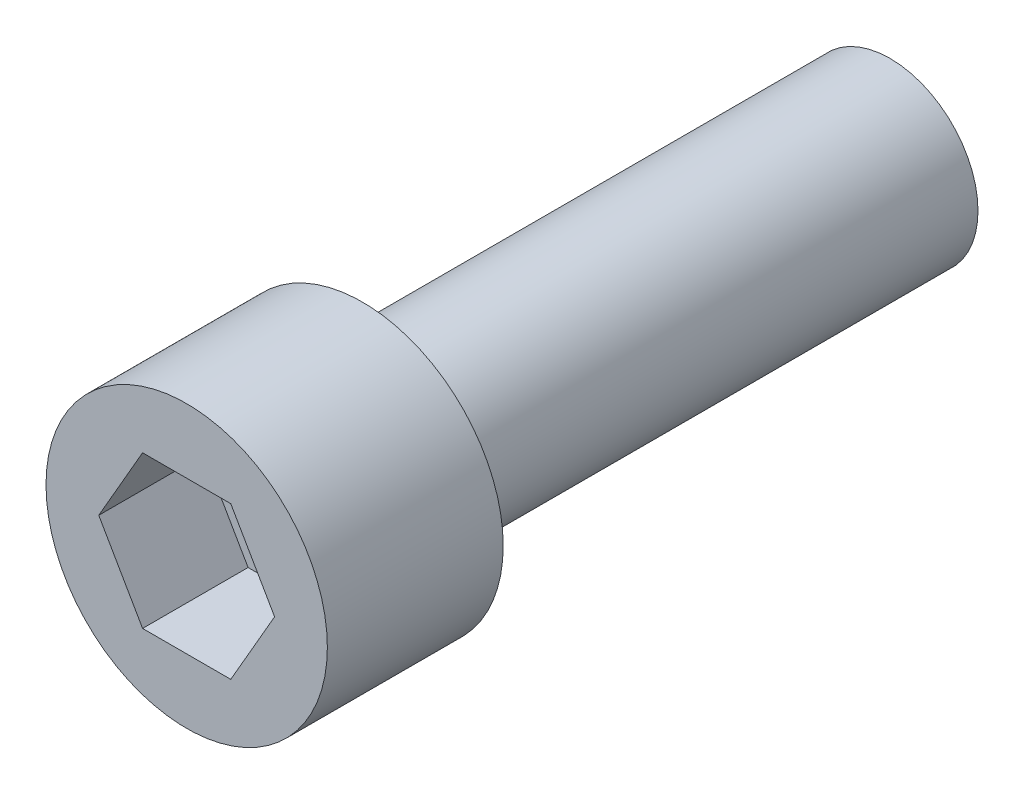
ISO-10303-21;
HEADER;
FILE_DESCRIPTION(('STEP AP214'),'2;1');
FILE_NAME('part.step','',(''),(''),'','','');
FILE_SCHEMA(('AUTOMOTIVE_DESIGN { 1 0 10303 214 1 1 1 1 }'));
ENDSEC;
DATA;
#1=APPLICATION_CONTEXT('core data for automotive mechanical design processes');
#2=APPLICATION_PROTOCOL_DEFINITION('international standard','automotive_design',2000,#1);
#3=PRODUCT_CONTEXT('',#1,'mechanical');
#4=PRODUCT('Part','Part','',(#3));
#5=PRODUCT_RELATED_PRODUCT_CATEGORY('part','',(#4));
#6=PRODUCT_DEFINITION_FORMATION('','',#4);
#7=PRODUCT_DEFINITION_CONTEXT('part definition',#1,'design');
#8=PRODUCT_DEFINITION('design','',#6,#7);
#9=PRODUCT_DEFINITION_SHAPE('','',#8);
#10=(LENGTH_UNIT() NAMED_UNIT(*) SI_UNIT(.MILLI.,.METRE.));
#11=(NAMED_UNIT(*) PLANE_ANGLE_UNIT() SI_UNIT($,.RADIAN.));
#12=(NAMED_UNIT(*) SI_UNIT($,.STERADIAN.) SOLID_ANGLE_UNIT());
#13=UNCERTAINTY_MEASURE_WITH_UNIT(LENGTH_MEASURE(1.E-05),#10,'distance_accuracy_value','');
#14=(GEOMETRIC_REPRESENTATION_CONTEXT(3) GLOBAL_UNCERTAINTY_ASSIGNED_CONTEXT((#13)) GLOBAL_UNIT_ASSIGNED_CONTEXT((#10,
#11,#12)) REPRESENTATION_CONTEXT('',''));
#15=CARTESIAN_POINT('',(0.,0.,0.));
#16=DIRECTION('',(0.,0.,1.));
#17=DIRECTION('',(1.,0.,0.));
#18=AXIS2_PLACEMENT_3D('',#15,#16,#17);
#19=CARTESIAN_POINT('',(0.,0.,0.));
#20=DIRECTION('',(0.,0.,1.));
#21=DIRECTION('',(1.,0.,0.));
#22=AXIS2_PLACEMENT_3D('',#19,#20,#21);
#23=PLANE('',#22);
#24=CARTESIAN_POINT('',(0.,0.,0.));
#25=DIRECTION('',(0.,0.,1.));
#26=DIRECTION('',(1.,0.,0.));
#27=AXIS2_PLACEMENT_3D('',#24,#25,#26);
#28=CIRCLE('',#27,4.);
#29=CARTESIAN_POINT('',(4.,0.,0.));
#30=VERTEX_POINT('',#29);
#31=EDGE_CURVE('E90',#30,#30,#28,.T.);
#32=ORIENTED_EDGE('',*,*,#31,.F.);
#33=EDGE_LOOP('',(#32));
#34=FACE_BOUND('',#33,.T.);
#35=CARTESIAN_POINT('',(0.,0.,0.));
#36=DIRECTION('',(0.,0.,-1.));
#37=DIRECTION('',(-1.,0.,0.));
#38=AXIS2_PLACEMENT_3D('',#35,#36,#37);
#39=CIRCLE('',#38,2.5);
#40=CARTESIAN_POINT('',(-2.5,0.,0.));
#41=VERTEX_POINT('',#40);
#42=EDGE_CURVE('E11',#41,#41,#39,.T.);
#43=ORIENTED_EDGE('',*,*,#42,.F.);
#44=EDGE_LOOP('',(#43));
#45=FACE_BOUND('',#44,.T.);
#46=ADVANCED_FACE('F33',(#34,#45),#23,.F.);
#47=CARTESIAN_POINT('',(0.,0.,5.));
#48=DIRECTION('',(0.,0.,1.));
#49=DIRECTION('',(1.,0.,0.));
#50=AXIS2_PLACEMENT_3D('',#47,#48,#49);
#51=PLANE('',#50);
#52=CARTESIAN_POINT('',(0.,0.,5.));
#53=DIRECTION('',(0.,0.,1.));
#54=DIRECTION('',(1.,0.,0.));
#55=AXIS2_PLACEMENT_3D('',#52,#53,#54);
#56=CIRCLE('',#55,4.);
#57=CARTESIAN_POINT('',(4.,0.,5.));
#58=VERTEX_POINT('',#57);
#59=EDGE_CURVE('E37',#58,#58,#56,.T.);
#60=ORIENTED_EDGE('',*,*,#59,.T.);
#61=EDGE_LOOP('',(#60));
#62=FACE_BOUND('',#61,.T.);
#63=DIRECTION('',(-1.,0.,0.));
#64=VECTOR('',#63,1.);
#65=CARTESIAN_POINT('',(1.25363455438758,-2.16296102693633,5.));
#66=LINE('',#65,#64);
#67=CARTESIAN_POINT('',(1.25363455438758,-2.16296102693633,5.));
#68=VERTEX_POINT('',#67);
#69=CARTESIAN_POINT('',(-1.25363455438761,-2.16296102693631,5.));
#70=VERTEX_POINT('',#69);
#71=EDGE_CURVE('E105',#68,#70,#66,.T.);
#72=ORIENTED_EDGE('',*,*,#71,.T.);
#73=DIRECTION('',(-0.499272559953456,0.866444984333987,0.));
#74=VECTOR('',#73,1.);
#75=CARTESIAN_POINT('',(-1.25363455438761,-2.16296102693631,5.));
#76=LINE('',#75,#74);
#77=CARTESIAN_POINT('',(-2.5,0.,5.));
#78=VERTEX_POINT('',#77);
#79=EDGE_CURVE('E49',#70,#78,#76,.T.);
#80=ORIENTED_EDGE('',*,*,#79,.T.);
#81=DIRECTION('',(0.499272559953463,0.866444984333983,0.));
#82=VECTOR('',#81,1.);
#83=CARTESIAN_POINT('',(-2.5,0.,5.));
#84=LINE('',#83,#82);
#85=CARTESIAN_POINT('',(-1.25363455438758,2.16296102693633,5.));
#86=VERTEX_POINT('',#85);
#87=EDGE_CURVE('E94',#78,#86,#84,.T.);
#88=ORIENTED_EDGE('',*,*,#87,.T.);
#89=DIRECTION('',(1.,0.,0.));
#90=VECTOR('',#89,1.);
#91=CARTESIAN_POINT('',(-1.25363455438758,2.16296102693633,5.));
#92=LINE('',#91,#90);
#93=CARTESIAN_POINT('',(1.25363455438758,2.16296102693633,5.));
#94=VERTEX_POINT('',#93);
#95=EDGE_CURVE('E99',#86,#94,#92,.T.);
#96=ORIENTED_EDGE('',*,*,#95,.T.);
#97=DIRECTION('',(0.499272559953464,-0.866444984333983,0.));
#98=VECTOR('',#97,1.);
#99=CARTESIAN_POINT('',(1.25363455438758,2.16296102693633,5.));
#100=LINE('',#99,#98);
#101=CARTESIAN_POINT('',(2.5,0.,5.));
#102=VERTEX_POINT('',#101);
#103=EDGE_CURVE('E112',#94,#102,#100,.T.);
#104=ORIENTED_EDGE('',*,*,#103,.T.);
#105=DIRECTION('',(-0.499272559953464,-0.866444984333983,0.));
#106=VECTOR('',#105,1.);
#107=CARTESIAN_POINT('',(2.5,0.,5.));
#108=LINE('',#107,#106);
#109=EDGE_CURVE('E115',#102,#68,#108,.T.);
#110=ORIENTED_EDGE('',*,*,#109,.T.);
#111=EDGE_LOOP('',(#72,#80,#88,#96,#104,#110));
#112=FACE_BOUND('',#111,.T.);
#113=ADVANCED_FACE('F102',(#62,#112),#51,.T.);
#114=CARTESIAN_POINT('',(0.,0.,5.));
#115=DIRECTION('',(0.,0.,-1.));
#116=DIRECTION('',(-1.,0.,0.));
#117=AXIS2_PLACEMENT_3D('',#114,#115,#116);
#118=CYLINDRICAL_SURFACE('',#117,4.);
#119=ORIENTED_EDGE('',*,*,#59,.F.);
#120=EDGE_LOOP('',(#119));
#121=FACE_BOUND('',#120,.T.);
#122=ORIENTED_EDGE('',*,*,#31,.T.);
#123=EDGE_LOOP('',(#122));
#124=FACE_BOUND('',#123,.T.);
#125=ADVANCED_FACE('F35',(#121,#124),#118,.T.);
#126=CARTESIAN_POINT('',(-1.25363455438761,-2.16296102693631,2.));
#127=DIRECTION('',(0.866444984333987,0.499272559953456,0.));
#128=DIRECTION('',(-0.499272559953456,0.866444984333987,0.));
#129=AXIS2_PLACEMENT_3D('',#126,#127,#128);
#130=PLANE('',#129);
#131=DIRECTION('',(0.,0.,1.));
#132=VECTOR('',#131,1.);
#133=CARTESIAN_POINT('',(-2.5,0.,2.));
#134=LINE('',#133,#132);
#135=CARTESIAN_POINT('',(-2.5,0.,2.));
#136=VERTEX_POINT('',#135);
#137=EDGE_CURVE('E83',#136,#78,#134,.T.);
#138=ORIENTED_EDGE('',*,*,#137,.T.);
#139=ORIENTED_EDGE('',*,*,#79,.F.);
#140=DIRECTION('',(0.,0.,1.));
#141=VECTOR('',#140,1.);
#142=CARTESIAN_POINT('',(-1.25363455438761,-2.16296102693631,2.));
#143=LINE('',#142,#141);
#144=CARTESIAN_POINT('',(-1.25363455438761,-2.16296102693631,2.));
#145=VERTEX_POINT('',#144);
#146=EDGE_CURVE('E53',#145,#70,#143,.T.);
#147=ORIENTED_EDGE('',*,*,#146,.F.);
#148=DIRECTION('',(-0.499272559953456,0.866444984333987,0.));
#149=VECTOR('',#148,1.);
#150=CARTESIAN_POINT('',(-1.25363455438761,-2.16296102693631,2.));
#151=LINE('',#150,#149);
#152=EDGE_CURVE('E86',#145,#136,#151,.T.);
#153=ORIENTED_EDGE('',*,*,#152,.T.);
#154=EDGE_LOOP('',(#138,#139,#147,#153));
#155=FACE_BOUND('',#154,.T.);
#156=ADVANCED_FACE('F85',(#155),#130,.T.);
#157=CARTESIAN_POINT('',(-2.5,0.,2.));
#158=DIRECTION('',(0.866444984333983,-0.499272559953463,0.));
#159=DIRECTION('',(0.499272559953463,0.866444984333983,0.));
#160=AXIS2_PLACEMENT_3D('',#157,#158,#159);
#161=PLANE('',#160);
#162=DIRECTION('',(0.,0.,1.));
#163=VECTOR('',#162,1.);
#164=CARTESIAN_POINT('',(-1.25363455438758,2.16296102693633,2.));
#165=LINE('',#164,#163);
#166=CARTESIAN_POINT('',(-1.25363455438758,2.16296102693633,2.));
#167=VERTEX_POINT('',#166);
#168=EDGE_CURVE('E91',#167,#86,#165,.T.);
#169=ORIENTED_EDGE('',*,*,#168,.T.);
#170=ORIENTED_EDGE('',*,*,#87,.F.);
#171=ORIENTED_EDGE('',*,*,#137,.F.);
#172=DIRECTION('',(0.499272559953463,0.866444984333983,0.));
#173=VECTOR('',#172,1.);
#174=CARTESIAN_POINT('',(-2.5,0.,2.));
#175=LINE('',#174,#173);
#176=EDGE_CURVE('E119',#136,#167,#175,.T.);
#177=ORIENTED_EDGE('',*,*,#176,.T.);
#178=EDGE_LOOP('',(#169,#170,#171,#177));
#179=FACE_BOUND('',#178,.T.);
#180=ADVANCED_FACE('F95',(#179),#161,.T.);
#181=CARTESIAN_POINT('',(-1.25363455438758,2.16296102693633,2.));
#182=DIRECTION('',(0.,-1.,0.));
#183=DIRECTION('',(0.,0.,-1.));
#184=AXIS2_PLACEMENT_3D('',#181,#182,#183);
#185=PLANE('',#184);
#186=DIRECTION('',(0.,0.,1.));
#187=VECTOR('',#186,1.);
#188=CARTESIAN_POINT('',(1.25363455438758,2.16296102693633,2.));
#189=LINE('',#188,#187);
#190=CARTESIAN_POINT('',(1.25363455438758,2.16296102693633,2.));
#191=VERTEX_POINT('',#190);
#192=EDGE_CURVE('E138',#191,#94,#189,.T.);
#193=ORIENTED_EDGE('',*,*,#192,.T.);
#194=ORIENTED_EDGE('',*,*,#95,.F.);
#195=ORIENTED_EDGE('',*,*,#168,.F.);
#196=DIRECTION('',(1.,0.,0.));
#197=VECTOR('',#196,1.);
#198=CARTESIAN_POINT('',(-1.25363455438758,2.16296102693633,2.));
#199=LINE('',#198,#197);
#200=EDGE_CURVE('E121',#167,#191,#199,.T.);
#201=ORIENTED_EDGE('',*,*,#200,.T.);
#202=EDGE_LOOP('',(#193,#194,#195,#201));
#203=FACE_BOUND('',#202,.T.);
#204=ADVANCED_FACE('F162',(#203),#185,.T.);
#205=CARTESIAN_POINT('',(1.25363455438758,2.16296102693633,2.));
#206=DIRECTION('',(-0.866444984333982,-0.499272559953463,0.));
#207=DIRECTION('',(0.499272559953464,-0.866444984333983,0.));
#208=AXIS2_PLACEMENT_3D('',#205,#206,#207);
#209=PLANE('',#208);
#210=DIRECTION('',(0.,0.,1.));
#211=VECTOR('',#210,1.);
#212=CARTESIAN_POINT('',(2.5,0.,2.));
#213=LINE('',#212,#211);
#214=CARTESIAN_POINT('',(2.5,0.,2.));
#215=VERTEX_POINT('',#214);
#216=EDGE_CURVE('E136',#215,#102,#213,.T.);
#217=ORIENTED_EDGE('',*,*,#216,.T.);
#218=ORIENTED_EDGE('',*,*,#103,.F.);
#219=ORIENTED_EDGE('',*,*,#192,.F.);
#220=DIRECTION('',(0.499272559953464,-0.866444984333983,0.));
#221=VECTOR('',#220,1.);
#222=CARTESIAN_POINT('',(1.25363455438758,2.16296102693633,2.));
#223=LINE('',#222,#221);
#224=EDGE_CURVE('E124',#191,#215,#223,.T.);
#225=ORIENTED_EDGE('',*,*,#224,.T.);
#226=EDGE_LOOP('',(#217,#218,#219,#225));
#227=FACE_BOUND('',#226,.T.);
#228=ADVANCED_FACE('F165',(#227),#209,.T.);
#229=CARTESIAN_POINT('',(2.5,0.,2.));
#230=DIRECTION('',(-0.866444984333982,0.499272559953463,0.));
#231=DIRECTION('',(-0.499272559953464,-0.866444984333983,0.));
#232=AXIS2_PLACEMENT_3D('',#229,#230,#231);
#233=PLANE('',#232);
#234=DIRECTION('',(0.,0.,1.));
#235=VECTOR('',#234,1.);
#236=CARTESIAN_POINT('',(1.25363455438758,-2.16296102693633,2.));
#237=LINE('',#236,#235);
#238=CARTESIAN_POINT('',(1.25363455438758,-2.16296102693633,2.));
#239=VERTEX_POINT('',#238);
#240=EDGE_CURVE('E134',#239,#68,#237,.T.);
#241=ORIENTED_EDGE('',*,*,#240,.T.);
#242=ORIENTED_EDGE('',*,*,#109,.F.);
#243=ORIENTED_EDGE('',*,*,#216,.F.);
#244=DIRECTION('',(-0.499272559953464,-0.866444984333983,0.));
#245=VECTOR('',#244,1.);
#246=CARTESIAN_POINT('',(2.5,0.,2.));
#247=LINE('',#246,#245);
#248=EDGE_CURVE('E127',#215,#239,#247,.T.);
#249=ORIENTED_EDGE('',*,*,#248,.T.);
#250=EDGE_LOOP('',(#241,#242,#243,#249));
#251=FACE_BOUND('',#250,.T.);
#252=ADVANCED_FACE('F169',(#251),#233,.T.);
#253=CARTESIAN_POINT('',(1.25363455438758,-2.16296102693633,2.));
#254=DIRECTION('',(0.,1.,0.));
#255=DIRECTION('',(-1.,0.,0.));
#256=AXIS2_PLACEMENT_3D('',#253,#254,#255);
#257=PLANE('',#256);
#258=DIRECTION('',(-1.,0.,0.));
#259=VECTOR('',#258,1.);
#260=CARTESIAN_POINT('',(1.25363455438758,-2.16296102693633,2.));
#261=LINE('',#260,#259);
#262=EDGE_CURVE('E130',#239,#145,#261,.T.);
#263=ORIENTED_EDGE('',*,*,#262,.T.);
#264=ORIENTED_EDGE('',*,*,#146,.T.);
#265=ORIENTED_EDGE('',*,*,#71,.F.);
#266=ORIENTED_EDGE('',*,*,#240,.F.);
#267=EDGE_LOOP('',(#263,#264,#265,#266));
#268=FACE_BOUND('',#267,.T.);
#269=ADVANCED_FACE('F173',(#268),#257,.T.);
#270=CARTESIAN_POINT('',(-3.7463654456124,2.16296102693633,2.));
#271=DIRECTION('',(0.,0.,-1.));
#272=DIRECTION('',(-1.,0.,0.));
#273=AXIS2_PLACEMENT_3D('',#270,#271,#272);
#274=PLANE('',#273);
#275=ORIENTED_EDGE('',*,*,#152,.F.);
#276=ORIENTED_EDGE('',*,*,#262,.F.);
#277=ORIENTED_EDGE('',*,*,#248,.F.);
#278=ORIENTED_EDGE('',*,*,#224,.F.);
#279=ORIENTED_EDGE('',*,*,#200,.F.);
#280=ORIENTED_EDGE('',*,*,#176,.F.);
#281=EDGE_LOOP('',(#275,#276,#277,#278,#279,#280));
#282=FACE_BOUND('',#281,.T.);
#283=ADVANCED_FACE('F175',(#282),#274,.F.);
#284=CARTESIAN_POINT('',(0.,0.,-15.));
#285=DIRECTION('',(0.,0.,1.));
#286=DIRECTION('',(1.,0.,0.));
#287=AXIS2_PLACEMENT_3D('',#284,#285,#286);
#288=CYLINDRICAL_SURFACE('',#287,2.5);
#289=CARTESIAN_POINT('',(0.,0.,-15.));
#290=DIRECTION('',(0.,0.,-1.));
#291=DIRECTION('',(-1.,0.,0.));
#292=AXIS2_PLACEMENT_3D('',#289,#290,#291);
#293=CIRCLE('',#292,2.5);
#294=CARTESIAN_POINT('',(-2.5,0.,-15.));
#295=VERTEX_POINT('',#294);
#296=EDGE_CURVE('E106',#295,#295,#293,.T.);
#297=ORIENTED_EDGE('',*,*,#296,.F.);
#298=EDGE_LOOP('',(#297));
#299=FACE_BOUND('',#298,.T.);
#300=ORIENTED_EDGE('',*,*,#42,.T.);
#301=EDGE_LOOP('',(#300));
#302=FACE_BOUND('',#301,.T.);
#303=ADVANCED_FACE('F182',(#299,#302),#288,.T.);
#304=CARTESIAN_POINT('',(0.,0.,-15.));
#305=DIRECTION('',(0.,0.,-1.));
#306=DIRECTION('',(-1.,0.,0.));
#307=AXIS2_PLACEMENT_3D('',#304,#305,#306);
#308=PLANE('',#307);
#309=ORIENTED_EDGE('',*,*,#296,.T.);
#310=EDGE_LOOP('',(#309));
#311=FACE_BOUND('',#310,.T.);
#312=ADVANCED_FACE('F178',(#311),#308,.T.);
#313=CLOSED_SHELL('',(#46,#113,#125,#156,#180,#204,#228,#252,#269,#283,#303,#312));
#314=MANIFOLD_SOLID_BREP('B2',#313);
#315=ADVANCED_BREP_SHAPE_REPRESENTATION('',(#18,#314),#14);
#316=SHAPE_DEFINITION_REPRESENTATION(#9,#315);
ENDSEC;
END-ISO-10303-21;
